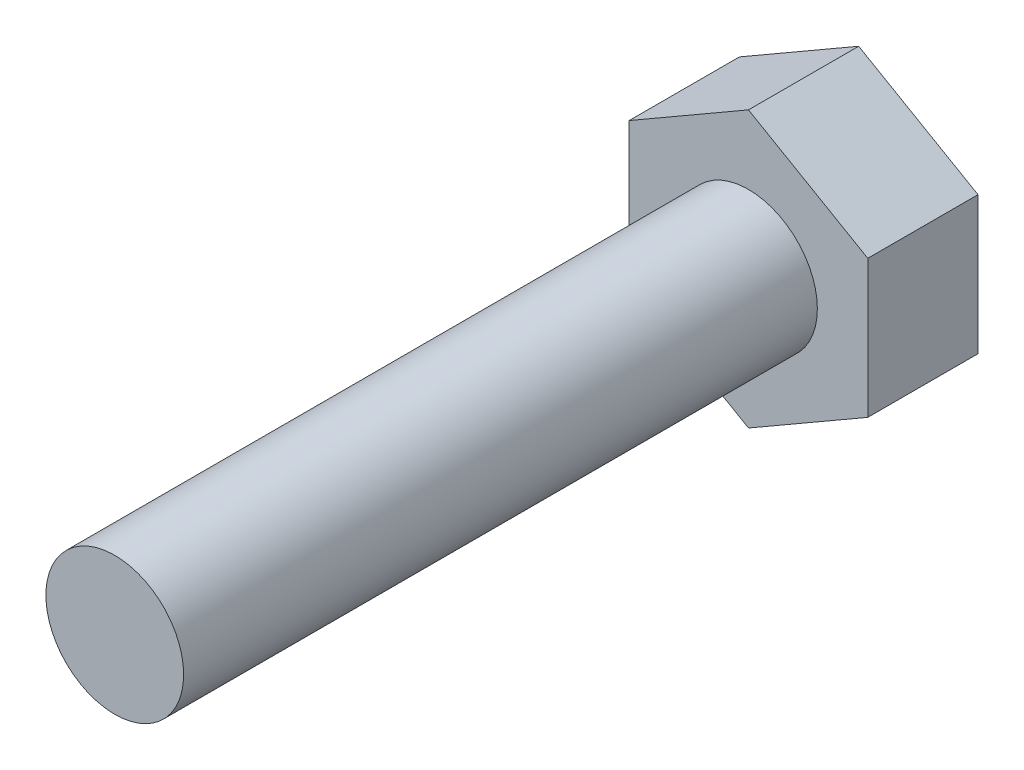
ISO-10303-21;
HEADER;
FILE_DESCRIPTION(('STEP AP214'),'2;1');
FILE_NAME('part.step','',(''),(''),'','','');
FILE_SCHEMA(('AUTOMOTIVE_DESIGN { 1 0 10303 214 1 1 1 1 }'));
ENDSEC;
DATA;
#1=APPLICATION_CONTEXT('core data for automotive mechanical design processes');
#2=APPLICATION_PROTOCOL_DEFINITION('international standard','automotive_design',2000,#1);
#3=PRODUCT_CONTEXT('',#1,'mechanical');
#4=PRODUCT('Part','Part','',(#3));
#5=PRODUCT_RELATED_PRODUCT_CATEGORY('part','',(#4));
#6=PRODUCT_DEFINITION_FORMATION('','',#4);
#7=PRODUCT_DEFINITION_CONTEXT('part definition',#1,'design');
#8=PRODUCT_DEFINITION('design','',#6,#7);
#9=PRODUCT_DEFINITION_SHAPE('','',#8);
#10=(LENGTH_UNIT() NAMED_UNIT(*) SI_UNIT(.MILLI.,.METRE.));
#11=(NAMED_UNIT(*) PLANE_ANGLE_UNIT() SI_UNIT($,.RADIAN.));
#12=(NAMED_UNIT(*) SI_UNIT($,.STERADIAN.) SOLID_ANGLE_UNIT());
#13=UNCERTAINTY_MEASURE_WITH_UNIT(LENGTH_MEASURE(1.E-05),#10,'distance_accuracy_value','');
#14=(GEOMETRIC_REPRESENTATION_CONTEXT(3) GLOBAL_UNCERTAINTY_ASSIGNED_CONTEXT((#13)) GLOBAL_UNIT_ASSIGNED_CONTEXT((#10,
#11,#12)) REPRESENTATION_CONTEXT('',''));
#15=CARTESIAN_POINT('',(0.,0.,0.));
#16=DIRECTION('',(0.,0.,1.));
#17=DIRECTION('',(1.,0.,0.));
#18=AXIS2_PLACEMENT_3D('',#15,#16,#17);
#19=CARTESIAN_POINT('',(0.,0.,11.5));
#20=DIRECTION('',(0.,0.,-1.));
#21=DIRECTION('',(-1.,0.,0.));
#22=AXIS2_PLACEMENT_3D('',#19,#20,#21);
#23=CYLINDRICAL_SURFACE('',#22,1.25);
#24=CARTESIAN_POINT('',(0.,0.,11.5));
#25=DIRECTION('',(0.,0.,1.));
#26=DIRECTION('',(1.,0.,0.));
#27=AXIS2_PLACEMENT_3D('',#24,#25,#26);
#28=CIRCLE('',#27,1.25);
#29=CARTESIAN_POINT('',(1.25,0.,11.5));
#30=VERTEX_POINT('',#29);
#31=EDGE_CURVE('E11',#30,#30,#28,.T.);
#32=ORIENTED_EDGE('',*,*,#31,.F.);
#33=EDGE_LOOP('',(#32));
#34=FACE_BOUND('',#33,.T.);
#35=CARTESIAN_POINT('',(0.,0.,0.));
#36=DIRECTION('',(0.,0.,1.));
#37=DIRECTION('',(1.,0.,0.));
#38=AXIS2_PLACEMENT_3D('',#35,#36,#37);
#39=CIRCLE('',#38,1.25);
#40=CARTESIAN_POINT('',(1.25,0.,0.));
#41=VERTEX_POINT('',#40);
#42=EDGE_CURVE('E48',#41,#41,#39,.T.);
#43=ORIENTED_EDGE('',*,*,#42,.T.);
#44=EDGE_LOOP('',(#43));
#45=FACE_BOUND('',#44,.T.);
#46=ADVANCED_FACE('F45',(#34,#45),#23,.T.);
#47=CARTESIAN_POINT('',(0.,0.,11.5));
#48=DIRECTION('',(0.,0.,1.));
#49=DIRECTION('',(1.,0.,0.));
#50=AXIS2_PLACEMENT_3D('',#47,#48,#49);
#51=PLANE('',#50);
#52=ORIENTED_EDGE('',*,*,#31,.T.);
#53=EDGE_LOOP('',(#52));
#54=FACE_BOUND('',#53,.T.);
#55=ADVANCED_FACE('F189',(#54),#51,.T.);
#56=CARTESIAN_POINT('',(-1.08253175473055,1.875,-2.));
#57=DIRECTION('',(0.5,-0.866025403784439,0.));
#58=DIRECTION('',(0.866025403784439,0.5,0.));
#59=AXIS2_PLACEMENT_3D('',#56,#57,#58);
#60=PLANE('',#59);
#61=DIRECTION('',(0.866025403784439,0.5,0.));
#62=VECTOR('',#61,1.);
#63=CARTESIAN_POINT('',(-1.08253175473055,1.875,0.));
#64=LINE('',#63,#62);
#65=CARTESIAN_POINT('',(-2.1650635094611,1.25,0.));
#66=VERTEX_POINT('',#65);
#67=CARTESIAN_POINT('',(0.,2.5,0.));
#68=VERTEX_POINT('',#67);
#69=EDGE_CURVE('E135',#66,#68,#64,.T.);
#70=ORIENTED_EDGE('',*,*,#69,.T.);
#71=DIRECTION('',(0.,0.,1.));
#72=VECTOR('',#71,1.);
#73=CARTESIAN_POINT('',(0.,2.5,-2.));
#74=LINE('',#73,#72);
#75=CARTESIAN_POINT('',(0.,2.5,-2.));
#76=VERTEX_POINT('',#75);
#77=EDGE_CURVE('E162',#76,#68,#74,.T.);
#78=ORIENTED_EDGE('',*,*,#77,.F.);
#79=DIRECTION('',(0.866025403784439,0.5,0.));
#80=VECTOR('',#79,1.);
#81=CARTESIAN_POINT('',(-1.08253175473055,1.875,-2.));
#82=LINE('',#81,#80);
#83=CARTESIAN_POINT('',(-2.1650635094611,1.25,-2.));
#84=VERTEX_POINT('',#83);
#85=EDGE_CURVE('E151',#84,#76,#82,.T.);
#86=ORIENTED_EDGE('',*,*,#85,.F.);
#87=DIRECTION('',(0.,0.,1.));
#88=VECTOR('',#87,1.);
#89=CARTESIAN_POINT('',(-2.1650635094611,1.25,-2.));
#90=LINE('',#89,#88);
#91=EDGE_CURVE('E131',#84,#66,#90,.T.);
#92=ORIENTED_EDGE('',*,*,#91,.T.);
#93=EDGE_LOOP('',(#70,#78,#86,#92));
#94=FACE_BOUND('',#93,.T.);
#95=ADVANCED_FACE('F177',(#94),#60,.F.);
#96=CARTESIAN_POINT('',(1.08253175473055,1.875,-2.));
#97=DIRECTION('',(-0.5,-0.866025403784439,0.));
#98=DIRECTION('',(0.866025403784439,-0.5,0.));
#99=AXIS2_PLACEMENT_3D('',#96,#97,#98);
#100=PLANE('',#99);
#101=DIRECTION('',(0.866025403784439,-0.5,0.));
#102=VECTOR('',#101,1.);
#103=CARTESIAN_POINT('',(1.08253175473055,1.875,0.));
#104=LINE('',#103,#102);
#105=CARTESIAN_POINT('',(2.1650635094611,1.25,0.));
#106=VERTEX_POINT('',#105);
#107=EDGE_CURVE('E139',#68,#106,#104,.T.);
#108=ORIENTED_EDGE('',*,*,#107,.T.);
#109=DIRECTION('',(0.,0.,1.));
#110=VECTOR('',#109,1.);
#111=CARTESIAN_POINT('',(2.1650635094611,1.25,-2.));
#112=LINE('',#111,#110);
#113=CARTESIAN_POINT('',(2.1650635094611,1.25,-2.));
#114=VERTEX_POINT('',#113);
#115=EDGE_CURVE('E158',#114,#106,#112,.T.);
#116=ORIENTED_EDGE('',*,*,#115,.F.);
#117=DIRECTION('',(0.866025403784439,-0.5,0.));
#118=VECTOR('',#117,1.);
#119=CARTESIAN_POINT('',(1.08253175473055,1.875,-2.));
#120=LINE('',#119,#118);
#121=EDGE_CURVE('E100',#76,#114,#120,.T.);
#122=ORIENTED_EDGE('',*,*,#121,.F.);
#123=ORIENTED_EDGE('',*,*,#77,.T.);
#124=EDGE_LOOP('',(#108,#116,#122,#123));
#125=FACE_BOUND('',#124,.T.);
#126=ADVANCED_FACE('F199',(#125),#100,.F.);
#127=CARTESIAN_POINT('',(2.1650635094611,0.,-2.));
#128=DIRECTION('',(-1.,0.,0.));
#129=DIRECTION('',(0.,0.,1.));
#130=AXIS2_PLACEMENT_3D('',#127,#128,#129);
#131=PLANE('',#130);
#132=DIRECTION('',(0.,-1.,0.));
#133=VECTOR('',#132,1.);
#134=CARTESIAN_POINT('',(2.1650635094611,0.,0.));
#135=LINE('',#134,#133);
#136=CARTESIAN_POINT('',(2.1650635094611,-1.25,0.));
#137=VERTEX_POINT('',#136);
#138=EDGE_CURVE('E142',#106,#137,#135,.T.);
#139=ORIENTED_EDGE('',*,*,#138,.T.);
#140=DIRECTION('',(0.,0.,1.));
#141=VECTOR('',#140,1.);
#142=CARTESIAN_POINT('',(2.1650635094611,-1.25,-2.));
#143=LINE('',#142,#141);
#144=CARTESIAN_POINT('',(2.1650635094611,-1.25,-2.));
#145=VERTEX_POINT('',#144);
#146=EDGE_CURVE('E124',#145,#137,#143,.T.);
#147=ORIENTED_EDGE('',*,*,#146,.F.);
#148=DIRECTION('',(0.,-1.,0.));
#149=VECTOR('',#148,1.);
#150=CARTESIAN_POINT('',(2.1650635094611,0.,-2.));
#151=LINE('',#150,#149);
#152=EDGE_CURVE('E113',#114,#145,#151,.T.);
#153=ORIENTED_EDGE('',*,*,#152,.F.);
#154=ORIENTED_EDGE('',*,*,#115,.T.);
#155=EDGE_LOOP('',(#139,#147,#153,#154));
#156=FACE_BOUND('',#155,.T.);
#157=ADVANCED_FACE('F204',(#156),#131,.F.);
#158=CARTESIAN_POINT('',(1.08253175473055,-1.875,-2.));
#159=DIRECTION('',(-0.5,0.866025403784439,0.));
#160=DIRECTION('',(-0.866025403784439,-0.5,0.));
#161=AXIS2_PLACEMENT_3D('',#158,#159,#160);
#162=PLANE('',#161);
#163=DIRECTION('',(-0.866025403784439,-0.5,0.));
#164=VECTOR('',#163,1.);
#165=CARTESIAN_POINT('',(1.08253175473055,-1.875,0.));
#166=LINE('',#165,#164);
#167=CARTESIAN_POINT('',(0.,-2.5,0.));
#168=VERTEX_POINT('',#167);
#169=EDGE_CURVE('E122',#137,#168,#166,.T.);
#170=ORIENTED_EDGE('',*,*,#169,.T.);
#171=DIRECTION('',(0.,0.,1.));
#172=VECTOR('',#171,1.);
#173=CARTESIAN_POINT('',(0.,-2.5,-2.));
#174=LINE('',#173,#172);
#175=CARTESIAN_POINT('',(0.,-2.5,-2.));
#176=VERTEX_POINT('',#175);
#177=EDGE_CURVE('E119',#176,#168,#174,.T.);
#178=ORIENTED_EDGE('',*,*,#177,.F.);
#179=DIRECTION('',(-0.866025403784439,-0.5,0.));
#180=VECTOR('',#179,1.);
#181=CARTESIAN_POINT('',(1.08253175473055,-1.875,-2.));
#182=LINE('',#181,#180);
#183=EDGE_CURVE('E107',#145,#176,#182,.T.);
#184=ORIENTED_EDGE('',*,*,#183,.F.);
#185=ORIENTED_EDGE('',*,*,#146,.T.);
#186=EDGE_LOOP('',(#170,#178,#184,#185));
#187=FACE_BOUND('',#186,.T.);
#188=ADVANCED_FACE('F120',(#187),#162,.F.);
#189=CARTESIAN_POINT('',(-1.08253175473055,-1.875,-2.));
#190=DIRECTION('',(0.5,0.866025403784439,0.));
#191=DIRECTION('',(-0.866025403784439,0.5,0.));
#192=AXIS2_PLACEMENT_3D('',#189,#190,#191);
#193=PLANE('',#192);
#194=DIRECTION('',(-0.866025403784439,0.5,0.));
#195=VECTOR('',#194,1.);
#196=CARTESIAN_POINT('',(-1.08253175473055,-1.875,0.));
#197=LINE('',#196,#195);
#198=CARTESIAN_POINT('',(-2.1650635094611,-1.25,0.));
#199=VERTEX_POINT('',#198);
#200=EDGE_CURVE('E85',#168,#199,#197,.T.);
#201=ORIENTED_EDGE('',*,*,#200,.T.);
#202=DIRECTION('',(0.,0.,1.));
#203=VECTOR('',#202,1.);
#204=CARTESIAN_POINT('',(-2.1650635094611,-1.25,-2.));
#205=LINE('',#204,#203);
#206=CARTESIAN_POINT('',(-2.1650635094611,-1.25,-2.));
#207=VERTEX_POINT('',#206);
#208=EDGE_CURVE('E125',#207,#199,#205,.T.);
#209=ORIENTED_EDGE('',*,*,#208,.F.);
#210=DIRECTION('',(-0.866025403784439,0.5,0.));
#211=VECTOR('',#210,1.);
#212=CARTESIAN_POINT('',(-1.08253175473055,-1.875,-2.));
#213=LINE('',#212,#211);
#214=EDGE_CURVE('E111',#176,#207,#213,.T.);
#215=ORIENTED_EDGE('',*,*,#214,.F.);
#216=ORIENTED_EDGE('',*,*,#177,.T.);
#217=EDGE_LOOP('',(#201,#209,#215,#216));
#218=FACE_BOUND('',#217,.T.);
#219=ADVANCED_FACE('F127',(#218),#193,.F.);
#220=CARTESIAN_POINT('',(-2.1650635094611,0.,-2.));
#221=DIRECTION('',(1.,0.,0.));
#222=DIRECTION('',(0.,1.,0.));
#223=AXIS2_PLACEMENT_3D('',#220,#221,#222);
#224=PLANE('',#223);
#225=DIRECTION('',(0.,1.,0.));
#226=VECTOR('',#225,1.);
#227=CARTESIAN_POINT('',(-2.1650635094611,0.,0.));
#228=LINE('',#227,#226);
#229=EDGE_CURVE('E91',#199,#66,#228,.T.);
#230=ORIENTED_EDGE('',*,*,#229,.T.);
#231=ORIENTED_EDGE('',*,*,#91,.F.);
#232=DIRECTION('',(0.,1.,0.));
#233=VECTOR('',#232,1.);
#234=CARTESIAN_POINT('',(-2.1650635094611,0.,-2.));
#235=LINE('',#234,#233);
#236=EDGE_CURVE('E62',#207,#84,#235,.T.);
#237=ORIENTED_EDGE('',*,*,#236,.F.);
#238=ORIENTED_EDGE('',*,*,#208,.T.);
#239=EDGE_LOOP('',(#230,#231,#237,#238));
#240=FACE_BOUND('',#239,.T.);
#241=ADVANCED_FACE('F179',(#240),#224,.F.);
#242=CARTESIAN_POINT('',(0.,0.,-2.));
#243=DIRECTION('',(0.,0.,-1.));
#244=DIRECTION('',(-1.,0.,0.));
#245=AXIS2_PLACEMENT_3D('',#242,#243,#244);
#246=PLANE('',#245);
#247=ORIENTED_EDGE('',*,*,#85,.T.);
#248=ORIENTED_EDGE('',*,*,#121,.T.);
#249=ORIENTED_EDGE('',*,*,#152,.T.);
#250=ORIENTED_EDGE('',*,*,#183,.T.);
#251=ORIENTED_EDGE('',*,*,#214,.T.);
#252=ORIENTED_EDGE('',*,*,#236,.T.);
#253=EDGE_LOOP('',(#247,#248,#249,#250,#251,#252));
#254=FACE_BOUND('',#253,.T.);
#255=ADVANCED_FACE('F109',(#254),#246,.T.);
#256=CARTESIAN_POINT('',(0.,0.,0.));
#257=DIRECTION('',(0.,0.,-1.));
#258=DIRECTION('',(-1.,0.,0.));
#259=AXIS2_PLACEMENT_3D('',#256,#257,#258);
#260=PLANE('',#259);
#261=ORIENTED_EDGE('',*,*,#42,.F.);
#262=EDGE_LOOP('',(#261));
#263=FACE_BOUND('',#262,.T.);
#264=ORIENTED_EDGE('',*,*,#69,.F.);
#265=ORIENTED_EDGE('',*,*,#229,.F.);
#266=ORIENTED_EDGE('',*,*,#200,.F.);
#267=ORIENTED_EDGE('',*,*,#169,.F.);
#268=ORIENTED_EDGE('',*,*,#138,.F.);
#269=ORIENTED_EDGE('',*,*,#107,.F.);
#270=EDGE_LOOP('',(#264,#265,#266,#267,#268,#269));
#271=FACE_BOUND('',#270,.T.);
#272=ADVANCED_FACE('F170',(#263,#271),#260,.F.);
#273=CLOSED_SHELL('',(#46,#55,#95,#126,#157,#188,#219,#241,#255,#272));
#274=MANIFOLD_SOLID_BREP('B2',#273);
#275=ADVANCED_BREP_SHAPE_REPRESENTATION('',(#18,#274),#14);
#276=SHAPE_DEFINITION_REPRESENTATION(#9,#275);
ENDSEC;
END-ISO-10303-21;
